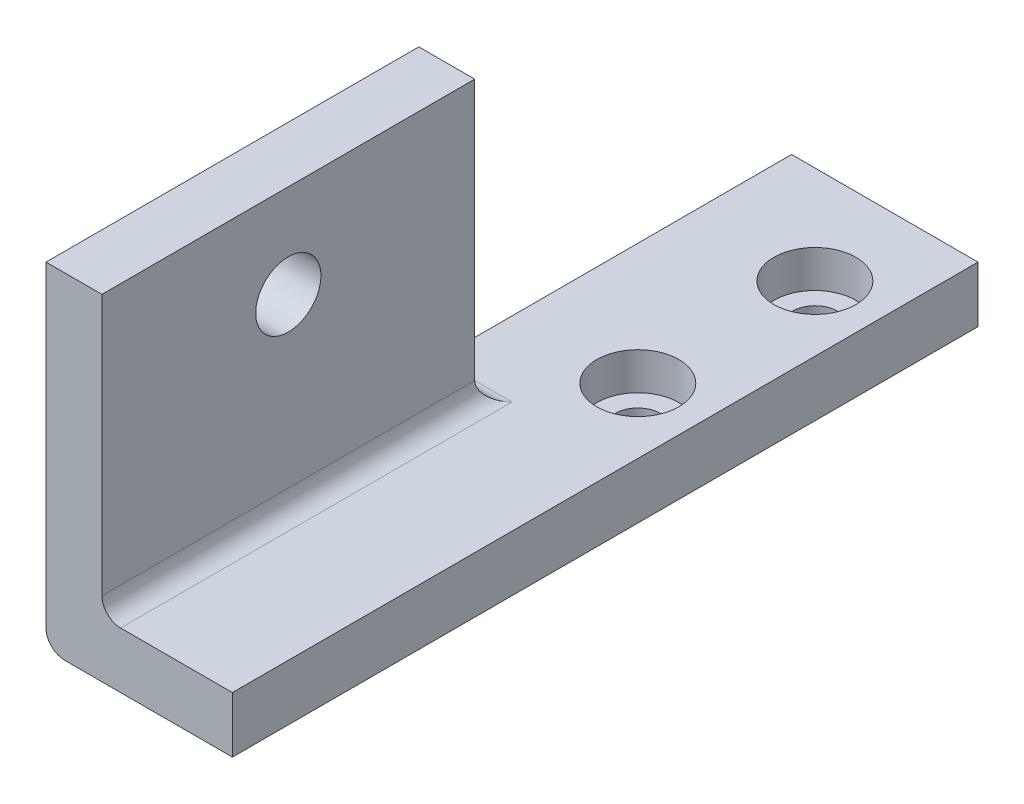
ISO-10303-21;
HEADER;
FILE_DESCRIPTION(('STEP AP214'),'2;1');
FILE_NAME('part.step','',(''),(''),'','','');
FILE_SCHEMA(('AUTOMOTIVE_DESIGN { 1 0 10303 214 1 1 1 1 }'));
ENDSEC;
DATA;
#1=APPLICATION_CONTEXT('core data for automotive mechanical design processes');
#2=APPLICATION_PROTOCOL_DEFINITION('international standard','automotive_design',2000,#1);
#3=PRODUCT_CONTEXT('',#1,'mechanical');
#4=PRODUCT('Part','Part','',(#3));
#5=PRODUCT_RELATED_PRODUCT_CATEGORY('part','',(#4));
#6=PRODUCT_DEFINITION_FORMATION('','',#4);
#7=PRODUCT_DEFINITION_CONTEXT('part definition',#1,'design');
#8=PRODUCT_DEFINITION('design','',#6,#7);
#9=PRODUCT_DEFINITION_SHAPE('','',#8);
#10=(LENGTH_UNIT() NAMED_UNIT(*) SI_UNIT(.MILLI.,.METRE.));
#11=(NAMED_UNIT(*) PLANE_ANGLE_UNIT() SI_UNIT($,.RADIAN.));
#12=(NAMED_UNIT(*) SI_UNIT($,.STERADIAN.) SOLID_ANGLE_UNIT());
#13=UNCERTAINTY_MEASURE_WITH_UNIT(LENGTH_MEASURE(1.E-05),#10,'distance_accuracy_value','');
#14=(GEOMETRIC_REPRESENTATION_CONTEXT(3) GLOBAL_UNCERTAINTY_ASSIGNED_CONTEXT((#13)) GLOBAL_UNIT_ASSIGNED_CONTEXT((#10,
#11,#12)) REPRESENTATION_CONTEXT('',''));
#15=CARTESIAN_POINT('',(0.,0.,0.));
#16=DIRECTION('',(0.,0.,1.));
#17=DIRECTION('',(1.,0.,0.));
#18=AXIS2_PLACEMENT_3D('',#15,#16,#17);
#19=CARTESIAN_POINT('',(0.,3.,0.));
#20=DIRECTION('',(0.,-1.,0.));
#21=DIRECTION('',(0.,0.,-1.));
#22=AXIS2_PLACEMENT_3D('',#19,#20,#21);
#23=PLANE('',#22);
#24=CARTESIAN_POINT('',(6.5,3.,-5.25));
#25=DIRECTION('',(0.,1.,0.));
#26=DIRECTION('',(0.,0.,1.));
#27=AXIS2_PLACEMENT_3D('',#24,#25,#26);
#28=CIRCLE('',#27,2.2);
#29=CARTESIAN_POINT('',(6.5,3.,-3.05));
#30=VERTEX_POINT('',#29);
#31=EDGE_CURVE('E170',#30,#30,#28,.T.);
#32=ORIENTED_EDGE('',*,*,#31,.F.);
#33=EDGE_LOOP('',(#32));
#34=FACE_BOUND('',#33,.T.);
#35=CARTESIAN_POINT('',(6.5,3.,-14.75));
#36=DIRECTION('',(0.,1.,0.));
#37=DIRECTION('',(0.,0.,1.));
#38=AXIS2_PLACEMENT_3D('',#35,#36,#37);
#39=CIRCLE('',#38,2.2);
#40=CARTESIAN_POINT('',(6.5,3.,-12.55));
#41=VERTEX_POINT('',#40);
#42=EDGE_CURVE('E158',#41,#41,#39,.T.);
#43=ORIENTED_EDGE('',*,*,#42,.F.);
#44=EDGE_LOOP('',(#43));
#45=FACE_BOUND('',#44,.T.);
#46=DIRECTION('',(0.,0.,1.));
#47=VECTOR('',#46,1.);
#48=CARTESIAN_POINT('',(0.,3.,0.));
#49=LINE('',#48,#47);
#50=CARTESIAN_POINT('',(0.,3.,-20.));
#51=VERTEX_POINT('',#50);
#52=CARTESIAN_POINT('',(0.,3.,-1.));
#53=VERTEX_POINT('',#52);
#54=EDGE_CURVE('E183',#51,#53,#49,.T.);
#55=ORIENTED_EDGE('',*,*,#54,.T.);
#56=DIRECTION('',(-1.,0.,0.));
#57=VECTOR('',#56,1.);
#58=CARTESIAN_POINT('',(3.,3.,-1.));
#59=LINE('',#58,#57);
#60=CARTESIAN_POINT('',(4.,3.,-1.));
#61=VERTEX_POINT('',#60);
#62=EDGE_CURVE('E203',#53,#61,#59,.F.);
#63=ORIENTED_EDGE('',*,*,#62,.T.);
#64=DIRECTION('',(0.,0.,-1.));
#65=VECTOR('',#64,1.);
#66=CARTESIAN_POINT('',(4.00000000000001,3.,20.));
#67=LINE('',#66,#65);
#68=CARTESIAN_POINT('',(4.00000000000001,3.,20.));
#69=VERTEX_POINT('',#68);
#70=EDGE_CURVE('E201',#61,#69,#67,.F.);
#71=ORIENTED_EDGE('',*,*,#70,.T.);
#72=DIRECTION('',(1.,0.,0.));
#73=VECTOR('',#72,1.);
#74=CARTESIAN_POINT('',(0.,3.,20.));
#75=LINE('',#74,#73);
#76=CARTESIAN_POINT('',(10.,3.,20.));
#77=VERTEX_POINT('',#76);
#78=EDGE_CURVE('E122',#69,#77,#75,.T.);
#79=ORIENTED_EDGE('',*,*,#78,.T.);
#80=DIRECTION('',(0.,0.,-1.));
#81=VECTOR('',#80,1.);
#82=CARTESIAN_POINT('',(10.,3.,0.));
#83=LINE('',#82,#81);
#84=CARTESIAN_POINT('',(10.,3.,-20.));
#85=VERTEX_POINT('',#84);
#86=EDGE_CURVE('E186',#77,#85,#83,.T.);
#87=ORIENTED_EDGE('',*,*,#86,.T.);
#88=DIRECTION('',(-1.,0.,0.));
#89=VECTOR('',#88,1.);
#90=CARTESIAN_POINT('',(0.,3.,-20.));
#91=LINE('',#90,#89);
#92=EDGE_CURVE('E189',#85,#51,#91,.T.);
#93=ORIENTED_EDGE('',*,*,#92,.T.);
#94=EDGE_LOOP('',(#55,#63,#71,#79,#87,#93));
#95=FACE_BOUND('',#94,.T.);
#96=ADVANCED_FACE('F39',(#34,#45,#95),#23,.F.);
#97=CARTESIAN_POINT('',(0.,0.,0.));
#98=DIRECTION('',(0.,-1.,0.));
#99=DIRECTION('',(0.,0.,-1.));
#100=AXIS2_PLACEMENT_3D('',#97,#98,#99);
#101=PLANE('',#100);
#102=CARTESIAN_POINT('',(6.5,0.,-14.75));
#103=DIRECTION('',(0.,1.,0.));
#104=DIRECTION('',(0.,0.,1.));
#105=AXIS2_PLACEMENT_3D('',#102,#103,#104);
#106=CIRCLE('',#105,1.2);
#107=CARTESIAN_POINT('',(6.5,0.,-13.55));
#108=VERTEX_POINT('',#107);
#109=EDGE_CURVE('E167',#108,#108,#106,.T.);
#110=ORIENTED_EDGE('',*,*,#109,.T.);
#111=EDGE_LOOP('',(#110));
#112=FACE_BOUND('',#111,.T.);
#113=CARTESIAN_POINT('',(6.5,0.,-5.25));
#114=DIRECTION('',(0.,1.,0.));
#115=DIRECTION('',(0.,0.,1.));
#116=AXIS2_PLACEMENT_3D('',#113,#114,#115);
#117=CIRCLE('',#116,1.2);
#118=CARTESIAN_POINT('',(6.5,0.,-4.05));
#119=VERTEX_POINT('',#118);
#120=EDGE_CURVE('E179',#119,#119,#117,.T.);
#121=ORIENTED_EDGE('',*,*,#120,.T.);
#122=EDGE_LOOP('',(#121));
#123=FACE_BOUND('',#122,.T.);
#124=DIRECTION('',(-1.,0.,0.));
#125=VECTOR('',#124,1.);
#126=CARTESIAN_POINT('',(0.,0.,20.));
#127=LINE('',#126,#125);
#128=CARTESIAN_POINT('',(10.,0.,20.));
#129=VERTEX_POINT('',#128);
#130=CARTESIAN_POINT('',(1.,0.,20.));
#131=VERTEX_POINT('',#130);
#132=EDGE_CURVE('E156',#129,#131,#127,.T.);
#133=ORIENTED_EDGE('',*,*,#132,.T.);
#134=DIRECTION('',(0.,0.,1.));
#135=VECTOR('',#134,1.);
#136=CARTESIAN_POINT('',(1.,0.,-20.));
#137=LINE('',#136,#135);
#138=CARTESIAN_POINT('',(1.,0.,-20.));
#139=VERTEX_POINT('',#138);
#140=EDGE_CURVE('E47',#131,#139,#137,.F.);
#141=ORIENTED_EDGE('',*,*,#140,.T.);
#142=DIRECTION('',(-1.,0.,0.));
#143=VECTOR('',#142,1.);
#144=CARTESIAN_POINT('',(0.,0.,-20.));
#145=LINE('',#144,#143);
#146=CARTESIAN_POINT('',(10.,0.,-20.));
#147=VERTEX_POINT('',#146);
#148=EDGE_CURVE('E187',#147,#139,#145,.T.);
#149=ORIENTED_EDGE('',*,*,#148,.F.);
#150=DIRECTION('',(0.,0.,-1.));
#151=VECTOR('',#150,1.);
#152=CARTESIAN_POINT('',(10.,0.,0.));
#153=LINE('',#152,#151);
#154=EDGE_CURVE('E182',#129,#147,#153,.T.);
#155=ORIENTED_EDGE('',*,*,#154,.F.);
#156=EDGE_LOOP('',(#133,#141,#149,#155));
#157=FACE_BOUND('',#156,.T.);
#158=ADVANCED_FACE('F254',(#112,#123,#157),#101,.T.);
#159=CARTESIAN_POINT('',(0.,3.,0.));
#160=DIRECTION('',(1.,0.,0.));
#161=DIRECTION('',(0.,0.,-1.));
#162=AXIS2_PLACEMENT_3D('',#159,#160,#161);
#163=PLANE('',#162);
#164=CARTESIAN_POINT('',(0.,13.,9.99999999999999));
#165=DIRECTION('',(1.,0.,0.));
#166=DIRECTION('',(0.,0.,-1.));
#167=AXIS2_PLACEMENT_3D('',#164,#165,#166);
#168=CIRCLE('',#167,1.75);
#169=CARTESIAN_POINT('',(0.,13.,8.24999999999999));
#170=VERTEX_POINT('',#169);
#171=EDGE_CURVE('E137',#170,#170,#168,.T.);
#172=ORIENTED_EDGE('',*,*,#171,.T.);
#173=EDGE_LOOP('',(#172));
#174=FACE_BOUND('',#173,.T.);
#175=DIRECTION('',(0.,-1.,0.));
#176=VECTOR('',#175,1.);
#177=CARTESIAN_POINT('',(0.,3.,-20.));
#178=LINE('',#177,#176);
#179=CARTESIAN_POINT('',(0.,1.,-20.));
#180=VERTEX_POINT('',#179);
#181=EDGE_CURVE('E191',#51,#180,#178,.T.);
#182=ORIENTED_EDGE('',*,*,#181,.T.);
#183=DIRECTION('',(0.,0.,1.));
#184=VECTOR('',#183,1.);
#185=CARTESIAN_POINT('',(0.,1.,20.));
#186=LINE('',#185,#184);
#187=CARTESIAN_POINT('',(0.,1.,20.));
#188=VERTEX_POINT('',#187);
#189=EDGE_CURVE('E121',#180,#188,#186,.T.);
#190=ORIENTED_EDGE('',*,*,#189,.T.);
#191=DIRECTION('',(0.,1.,0.));
#192=VECTOR('',#191,1.);
#193=CARTESIAN_POINT('',(0.,0.,20.));
#194=LINE('',#193,#192);
#195=CARTESIAN_POINT('',(0.,18.,20.));
#196=VERTEX_POINT('',#195);
#197=EDGE_CURVE('E113',#188,#196,#194,.T.);
#198=ORIENTED_EDGE('',*,*,#197,.T.);
#199=DIRECTION('',(0.,0.,1.));
#200=VECTOR('',#199,1.);
#201=CARTESIAN_POINT('',(0.,18.,20.));
#202=LINE('',#201,#200);
#203=CARTESIAN_POINT('',(0.,18.,0.));
#204=VERTEX_POINT('',#203);
#205=EDGE_CURVE('E119',#204,#196,#202,.T.);
#206=ORIENTED_EDGE('',*,*,#205,.F.);
#207=DIRECTION('',(0.,-1.,0.));
#208=VECTOR('',#207,1.);
#209=CARTESIAN_POINT('',(0.,18.,0.));
#210=LINE('',#209,#208);
#211=CARTESIAN_POINT('',(0.,4.,0.));
#212=VERTEX_POINT('',#211);
#213=EDGE_CURVE('E146',#204,#212,#210,.T.);
#214=ORIENTED_EDGE('',*,*,#213,.T.);
#215=CARTESIAN_POINT('',(0.,4.,-1.));
#216=DIRECTION('',(1.,0.,0.));
#217=DIRECTION('',(0.,0.,-1.));
#218=AXIS2_PLACEMENT_3D('',#215,#216,#217);
#219=CIRCLE('',#218,1.);
#220=EDGE_CURVE('E207',#212,#53,#219,.T.);
#221=ORIENTED_EDGE('',*,*,#220,.T.);
#222=ORIENTED_EDGE('',*,*,#54,.F.);
#223=EDGE_LOOP('',(#182,#190,#198,#206,#214,#221,#222));
#224=FACE_BOUND('',#223,.T.);
#225=ADVANCED_FACE('F116',(#174,#224),#163,.F.);
#226=CARTESIAN_POINT('',(10.,3.,0.));
#227=DIRECTION('',(-1.,0.,0.));
#228=DIRECTION('',(0.,0.,1.));
#229=AXIS2_PLACEMENT_3D('',#226,#227,#228);
#230=PLANE('',#229);
#231=ORIENTED_EDGE('',*,*,#154,.T.);
#232=DIRECTION('',(0.,-1.,0.));
#233=VECTOR('',#232,1.);
#234=CARTESIAN_POINT('',(10.,3.,-20.));
#235=LINE('',#234,#233);
#236=EDGE_CURVE('E195',#85,#147,#235,.T.);
#237=ORIENTED_EDGE('',*,*,#236,.F.);
#238=ORIENTED_EDGE('',*,*,#86,.F.);
#239=DIRECTION('',(0.,-1.,0.));
#240=VECTOR('',#239,1.);
#241=CARTESIAN_POINT('',(10.,0.,20.));
#242=LINE('',#241,#240);
#243=EDGE_CURVE('E153',#77,#129,#242,.T.);
#244=ORIENTED_EDGE('',*,*,#243,.T.);
#245=EDGE_LOOP('',(#231,#237,#238,#244));
#246=FACE_BOUND('',#245,.T.);
#247=ADVANCED_FACE('F271',(#246),#230,.F.);
#248=CARTESIAN_POINT('',(0.,3.,-20.));
#249=DIRECTION('',(0.,0.,1.));
#250=DIRECTION('',(1.,0.,0.));
#251=AXIS2_PLACEMENT_3D('',#248,#249,#250);
#252=PLANE('',#251);
#253=ORIENTED_EDGE('',*,*,#148,.T.);
#254=CARTESIAN_POINT('',(1.,1.,-20.));
#255=DIRECTION('',(0.,0.,1.));
#256=DIRECTION('',(1.,0.,0.));
#257=AXIS2_PLACEMENT_3D('',#254,#255,#256);
#258=CIRCLE('',#257,1.);
#259=EDGE_CURVE('E11',#139,#180,#258,.F.);
#260=ORIENTED_EDGE('',*,*,#259,.T.);
#261=ORIENTED_EDGE('',*,*,#181,.F.);
#262=ORIENTED_EDGE('',*,*,#92,.F.);
#263=ORIENTED_EDGE('',*,*,#236,.T.);
#264=EDGE_LOOP('',(#253,#260,#261,#262,#263));
#265=FACE_BOUND('',#264,.T.);
#266=ADVANCED_FACE('F244',(#265),#252,.F.);
#267=CARTESIAN_POINT('',(6.5,3.,-5.25));
#268=DIRECTION('',(0.,1.,0.));
#269=DIRECTION('',(0.,0.,1.));
#270=AXIS2_PLACEMENT_3D('',#267,#268,#269);
#271=CYLINDRICAL_SURFACE('',#270,1.2);
#272=ORIENTED_EDGE('',*,*,#120,.F.);
#273=EDGE_LOOP('',(#272));
#274=FACE_BOUND('',#273,.T.);
#275=CARTESIAN_POINT('',(6.5,1.,-5.25));
#276=DIRECTION('',(0.,1.,0.));
#277=DIRECTION('',(0.,0.,1.));
#278=AXIS2_PLACEMENT_3D('',#275,#276,#277);
#279=CIRCLE('',#278,1.2);
#280=CARTESIAN_POINT('',(6.5,1.,-4.05));
#281=VERTEX_POINT('',#280);
#282=EDGE_CURVE('E176',#281,#281,#279,.T.);
#283=ORIENTED_EDGE('',*,*,#282,.T.);
#284=EDGE_LOOP('',(#283));
#285=FACE_BOUND('',#284,.T.);
#286=ADVANCED_FACE('F266',(#274,#285),#271,.F.);
#287=CARTESIAN_POINT('',(7.7,1.,-5.25));
#288=DIRECTION('',(0.,-1.,0.));
#289=DIRECTION('',(0.,0.,-1.));
#290=AXIS2_PLACEMENT_3D('',#287,#288,#289);
#291=PLANE('',#290);
#292=ORIENTED_EDGE('',*,*,#282,.F.);
#293=EDGE_LOOP('',(#292));
#294=FACE_BOUND('',#293,.T.);
#295=CARTESIAN_POINT('',(6.5,1.,-5.25));
#296=DIRECTION('',(0.,1.,0.));
#297=DIRECTION('',(0.,0.,1.));
#298=AXIS2_PLACEMENT_3D('',#295,#296,#297);
#299=CIRCLE('',#298,2.2);
#300=CARTESIAN_POINT('',(6.5,1.,-3.05));
#301=VERTEX_POINT('',#300);
#302=EDGE_CURVE('E173',#301,#301,#299,.T.);
#303=ORIENTED_EDGE('',*,*,#302,.T.);
#304=EDGE_LOOP('',(#303));
#305=FACE_BOUND('',#304,.T.);
#306=ADVANCED_FACE('F305',(#294,#305),#291,.F.);
#307=CARTESIAN_POINT('',(6.5,3.,-5.25));
#308=DIRECTION('',(0.,1.,0.));
#309=DIRECTION('',(0.,0.,1.));
#310=AXIS2_PLACEMENT_3D('',#307,#308,#309);
#311=CYLINDRICAL_SURFACE('',#310,2.2);
#312=ORIENTED_EDGE('',*,*,#302,.F.);
#313=EDGE_LOOP('',(#312));
#314=FACE_BOUND('',#313,.T.);
#315=ORIENTED_EDGE('',*,*,#31,.T.);
#316=EDGE_LOOP('',(#315));
#317=FACE_BOUND('',#316,.T.);
#318=ADVANCED_FACE('F302',(#314,#317),#311,.F.);
#319=CARTESIAN_POINT('',(6.5,3.,-14.75));
#320=DIRECTION('',(0.,1.,0.));
#321=DIRECTION('',(0.,0.,1.));
#322=AXIS2_PLACEMENT_3D('',#319,#320,#321);
#323=CYLINDRICAL_SURFACE('',#322,1.2);
#324=ORIENTED_EDGE('',*,*,#109,.F.);
#325=EDGE_LOOP('',(#324));
#326=FACE_BOUND('',#325,.T.);
#327=CARTESIAN_POINT('',(6.5,1.,-14.75));
#328=DIRECTION('',(0.,1.,0.));
#329=DIRECTION('',(0.,0.,1.));
#330=AXIS2_PLACEMENT_3D('',#327,#328,#329);
#331=CIRCLE('',#330,1.2);
#332=CARTESIAN_POINT('',(6.5,1.,-13.55));
#333=VERTEX_POINT('',#332);
#334=EDGE_CURVE('E164',#333,#333,#331,.T.);
#335=ORIENTED_EDGE('',*,*,#334,.T.);
#336=EDGE_LOOP('',(#335));
#337=FACE_BOUND('',#336,.T.);
#338=ADVANCED_FACE('F298',(#326,#337),#323,.F.);
#339=CARTESIAN_POINT('',(7.7,1.,-14.75));
#340=DIRECTION('',(0.,-1.,0.));
#341=DIRECTION('',(0.,0.,-1.));
#342=AXIS2_PLACEMENT_3D('',#339,#340,#341);
#343=PLANE('',#342);
#344=ORIENTED_EDGE('',*,*,#334,.F.);
#345=EDGE_LOOP('',(#344));
#346=FACE_BOUND('',#345,.T.);
#347=CARTESIAN_POINT('',(6.5,1.,-14.75));
#348=DIRECTION('',(0.,1.,0.));
#349=DIRECTION('',(0.,0.,1.));
#350=AXIS2_PLACEMENT_3D('',#347,#348,#349);
#351=CIRCLE('',#350,2.2);
#352=CARTESIAN_POINT('',(6.5,1.,-12.55));
#353=VERTEX_POINT('',#352);
#354=EDGE_CURVE('E161',#353,#353,#351,.T.);
#355=ORIENTED_EDGE('',*,*,#354,.T.);
#356=EDGE_LOOP('',(#355));
#357=FACE_BOUND('',#356,.T.);
#358=ADVANCED_FACE('F294',(#346,#357),#343,.F.);
#359=CARTESIAN_POINT('',(6.5,3.,-14.75));
#360=DIRECTION('',(0.,1.,0.));
#361=DIRECTION('',(0.,0.,1.));
#362=AXIS2_PLACEMENT_3D('',#359,#360,#361);
#363=CYLINDRICAL_SURFACE('',#362,2.2);
#364=ORIENTED_EDGE('',*,*,#354,.F.);
#365=EDGE_LOOP('',(#364));
#366=FACE_BOUND('',#365,.T.);
#367=ORIENTED_EDGE('',*,*,#42,.T.);
#368=EDGE_LOOP('',(#367));
#369=FACE_BOUND('',#368,.T.);
#370=ADVANCED_FACE('F291',(#366,#369),#363,.F.);
#371=CARTESIAN_POINT('',(0.,0.,20.));
#372=DIRECTION('',(0.,0.,-1.));
#373=DIRECTION('',(-1.,0.,0.));
#374=AXIS2_PLACEMENT_3D('',#371,#372,#373);
#375=PLANE('',#374);
#376=ORIENTED_EDGE('',*,*,#197,.F.);
#377=CARTESIAN_POINT('',(1.,1.,20.));
#378=DIRECTION('',(0.,0.,-1.));
#379=DIRECTION('',(-1.,0.,0.));
#380=AXIS2_PLACEMENT_3D('',#377,#378,#379);
#381=CIRCLE('',#380,1.);
#382=EDGE_CURVE('E61',#188,#131,#381,.F.);
#383=ORIENTED_EDGE('',*,*,#382,.T.);
#384=ORIENTED_EDGE('',*,*,#132,.F.);
#385=ORIENTED_EDGE('',*,*,#243,.F.);
#386=ORIENTED_EDGE('',*,*,#78,.F.);
#387=CARTESIAN_POINT('',(4.00000000000001,4.,20.));
#388=DIRECTION('',(0.,0.,-1.));
#389=DIRECTION('',(-1.,0.,0.));
#390=AXIS2_PLACEMENT_3D('',#387,#388,#389);
#391=CIRCLE('',#390,1.);
#392=CARTESIAN_POINT('',(3.00000000000001,4.,20.));
#393=VERTEX_POINT('',#392);
#394=EDGE_CURVE('E209',#69,#393,#391,.T.);
#395=ORIENTED_EDGE('',*,*,#394,.T.);
#396=DIRECTION('',(0.,-1.,0.));
#397=VECTOR('',#396,1.);
#398=CARTESIAN_POINT('',(3.00000000000001,18.,20.));
#399=LINE('',#398,#397);
#400=CARTESIAN_POINT('',(3.00000000000001,18.,20.));
#401=VERTEX_POINT('',#400);
#402=EDGE_CURVE('E123',#401,#393,#399,.T.);
#403=ORIENTED_EDGE('',*,*,#402,.F.);
#404=DIRECTION('',(1.,0.,0.));
#405=VECTOR('',#404,1.);
#406=CARTESIAN_POINT('',(0.,18.,20.));
#407=LINE('',#406,#405);
#408=EDGE_CURVE('E126',#196,#401,#407,.T.);
#409=ORIENTED_EDGE('',*,*,#408,.F.);
#410=EDGE_LOOP('',(#376,#383,#384,#385,#386,#395,#403,#409));
#411=FACE_BOUND('',#410,.T.);
#412=ADVANCED_FACE('F127',(#411),#375,.F.);
#413=CARTESIAN_POINT('',(3.00000000000001,18.,20.));
#414=DIRECTION('',(-1.,0.,0.));
#415=DIRECTION('',(0.,0.,1.));
#416=AXIS2_PLACEMENT_3D('',#413,#414,#415);
#417=PLANE('',#416);
#418=CARTESIAN_POINT('',(3.,13.,9.99999999999999));
#419=DIRECTION('',(1.,0.,0.));
#420=DIRECTION('',(0.,0.,-1.));
#421=AXIS2_PLACEMENT_3D('',#418,#419,#420);
#422=CIRCLE('',#421,1.75);
#423=CARTESIAN_POINT('',(3.,13.,8.24999999999999));
#424=VERTEX_POINT('',#423);
#425=EDGE_CURVE('E140',#424,#424,#422,.T.);
#426=ORIENTED_EDGE('',*,*,#425,.F.);
#427=EDGE_LOOP('',(#426));
#428=FACE_BOUND('',#427,.T.);
#429=ORIENTED_EDGE('',*,*,#402,.T.);
#430=DIRECTION('',(0.,0.,-1.));
#431=VECTOR('',#430,1.);
#432=CARTESIAN_POINT('',(3.,4.,0.));
#433=LINE('',#432,#431);
#434=CARTESIAN_POINT('',(3.,4.,0.));
#435=VERTEX_POINT('',#434);
#436=EDGE_CURVE('E205',#393,#435,#433,.T.);
#437=ORIENTED_EDGE('',*,*,#436,.T.);
#438=DIRECTION('',(0.,-1.,0.));
#439=VECTOR('',#438,1.);
#440=CARTESIAN_POINT('',(3.,18.,0.));
#441=LINE('',#440,#439);
#442=CARTESIAN_POINT('',(3.,18.,0.));
#443=VERTEX_POINT('',#442);
#444=EDGE_CURVE('E148',#443,#435,#441,.T.);
#445=ORIENTED_EDGE('',*,*,#444,.F.);
#446=DIRECTION('',(0.,0.,-1.));
#447=VECTOR('',#446,1.);
#448=CARTESIAN_POINT('',(3.00000000000001,18.,20.));
#449=LINE('',#448,#447);
#450=EDGE_CURVE('E131',#401,#443,#449,.T.);
#451=ORIENTED_EDGE('',*,*,#450,.F.);
#452=EDGE_LOOP('',(#429,#437,#445,#451));
#453=FACE_BOUND('',#452,.T.);
#454=ADVANCED_FACE('F224',(#428,#453),#417,.F.);
#455=CARTESIAN_POINT('',(0.,18.,0.));
#456=DIRECTION('',(0.,0.,1.));
#457=DIRECTION('',(1.,0.,0.));
#458=AXIS2_PLACEMENT_3D('',#455,#456,#457);
#459=PLANE('',#458);
#460=ORIENTED_EDGE('',*,*,#444,.T.);
#461=DIRECTION('',(-1.,0.,0.));
#462=VECTOR('',#461,1.);
#463=CARTESIAN_POINT('',(0.,4.,0.));
#464=LINE('',#463,#462);
#465=EDGE_CURVE('E198',#435,#212,#464,.T.);
#466=ORIENTED_EDGE('',*,*,#465,.T.);
#467=ORIENTED_EDGE('',*,*,#213,.F.);
#468=DIRECTION('',(-1.,0.,0.));
#469=VECTOR('',#468,1.);
#470=CARTESIAN_POINT('',(0.,18.,0.));
#471=LINE('',#470,#469);
#472=EDGE_CURVE('E135',#443,#204,#471,.T.);
#473=ORIENTED_EDGE('',*,*,#472,.F.);
#474=EDGE_LOOP('',(#460,#466,#467,#473));
#475=FACE_BOUND('',#474,.T.);
#476=ADVANCED_FACE('F227',(#475),#459,.F.);
#477=CARTESIAN_POINT('',(0.,18.,0.));
#478=DIRECTION('',(0.,-1.,0.));
#479=DIRECTION('',(0.,0.,-1.));
#480=AXIS2_PLACEMENT_3D('',#477,#478,#479);
#481=PLANE('',#480);
#482=ORIENTED_EDGE('',*,*,#205,.T.);
#483=ORIENTED_EDGE('',*,*,#408,.T.);
#484=ORIENTED_EDGE('',*,*,#450,.T.);
#485=ORIENTED_EDGE('',*,*,#472,.T.);
#486=EDGE_LOOP('',(#482,#483,#484,#485));
#487=FACE_BOUND('',#486,.T.);
#488=ADVANCED_FACE('F133',(#487),#481,.F.);
#489=CARTESIAN_POINT('',(0.,13.,9.99999999999999));
#490=DIRECTION('',(1.,0.,0.));
#491=DIRECTION('',(0.,0.,-1.));
#492=AXIS2_PLACEMENT_3D('',#489,#490,#491);
#493=CYLINDRICAL_SURFACE('',#492,1.75);
#494=ORIENTED_EDGE('',*,*,#171,.F.);
#495=EDGE_LOOP('',(#494));
#496=FACE_BOUND('',#495,.T.);
#497=ORIENTED_EDGE('',*,*,#425,.T.);
#498=EDGE_LOOP('',(#497));
#499=FACE_BOUND('',#498,.T.);
#500=ADVANCED_FACE('F222',(#496,#499),#493,.F.);
#501=CARTESIAN_POINT('',(4.00000000000001,4.,20.));
#502=DIRECTION('',(0.,0.,1.));
#503=DIRECTION('',(1.,0.,0.));
#504=AXIS2_PLACEMENT_3D('',#501,#502,#503);
#505=CYLINDRICAL_SURFACE('',#504,1.);
#506=ORIENTED_EDGE('',*,*,#394,.F.);
#507=ORIENTED_EDGE('',*,*,#70,.F.);
#508=CARTESIAN_POINT('',(4.,4.,-1.));
#509=DIRECTION('',(0.707106781186548,0.,0.707106781186547));
#510=DIRECTION('',(-0.707106781186547,0.,0.707106781186548));
#511=AXIS2_PLACEMENT_3D('',#508,#509,#510);
#512=ELLIPSE('',#511,1.41421356237309,1.);
#513=EDGE_CURVE('E211',#435,#61,#512,.T.);
#514=ORIENTED_EDGE('',*,*,#513,.F.);
#515=ORIENTED_EDGE('',*,*,#436,.F.);
#516=EDGE_LOOP('',(#506,#507,#514,#515));
#517=FACE_BOUND('',#516,.T.);
#518=ADVANCED_FACE('F233',(#517),#505,.F.);
#519=CARTESIAN_POINT('',(0.,4.,-1.));
#520=DIRECTION('',(1.,0.,0.));
#521=DIRECTION('',(0.,0.,-1.));
#522=AXIS2_PLACEMENT_3D('',#519,#520,#521);
#523=CYLINDRICAL_SURFACE('',#522,1.);
#524=ORIENTED_EDGE('',*,*,#513,.T.);
#525=ORIENTED_EDGE('',*,*,#62,.F.);
#526=ORIENTED_EDGE('',*,*,#220,.F.);
#527=ORIENTED_EDGE('',*,*,#465,.F.);
#528=EDGE_LOOP('',(#524,#525,#526,#527));
#529=FACE_BOUND('',#528,.T.);
#530=ADVANCED_FACE('F235',(#529),#523,.F.);
#531=CARTESIAN_POINT('',(1.,1.,0.));
#532=DIRECTION('',(0.,0.,-1.));
#533=DIRECTION('',(-1.,0.,0.));
#534=AXIS2_PLACEMENT_3D('',#531,#532,#533);
#535=CYLINDRICAL_SURFACE('',#534,1.);
#536=ORIENTED_EDGE('',*,*,#259,.F.);
#537=ORIENTED_EDGE('',*,*,#140,.F.);
#538=ORIENTED_EDGE('',*,*,#382,.F.);
#539=ORIENTED_EDGE('',*,*,#189,.F.);
#540=EDGE_LOOP('',(#536,#537,#538,#539));
#541=FACE_BOUND('',#540,.T.);
#542=ADVANCED_FACE('F41',(#541),#535,.T.);
#543=CLOSED_SHELL('',(#96,#158,#225,#247,#266,#286,#306,#318,#338,#358,#370,#412,#454,#476,#488,
#500,#518,#530,#542));
#544=MANIFOLD_SOLID_BREP('B2',#543);
#545=ADVANCED_BREP_SHAPE_REPRESENTATION('',(#18,#544),#14);
#546=SHAPE_DEFINITION_REPRESENTATION(#9,#545);
ENDSEC;
END-ISO-10303-21;
